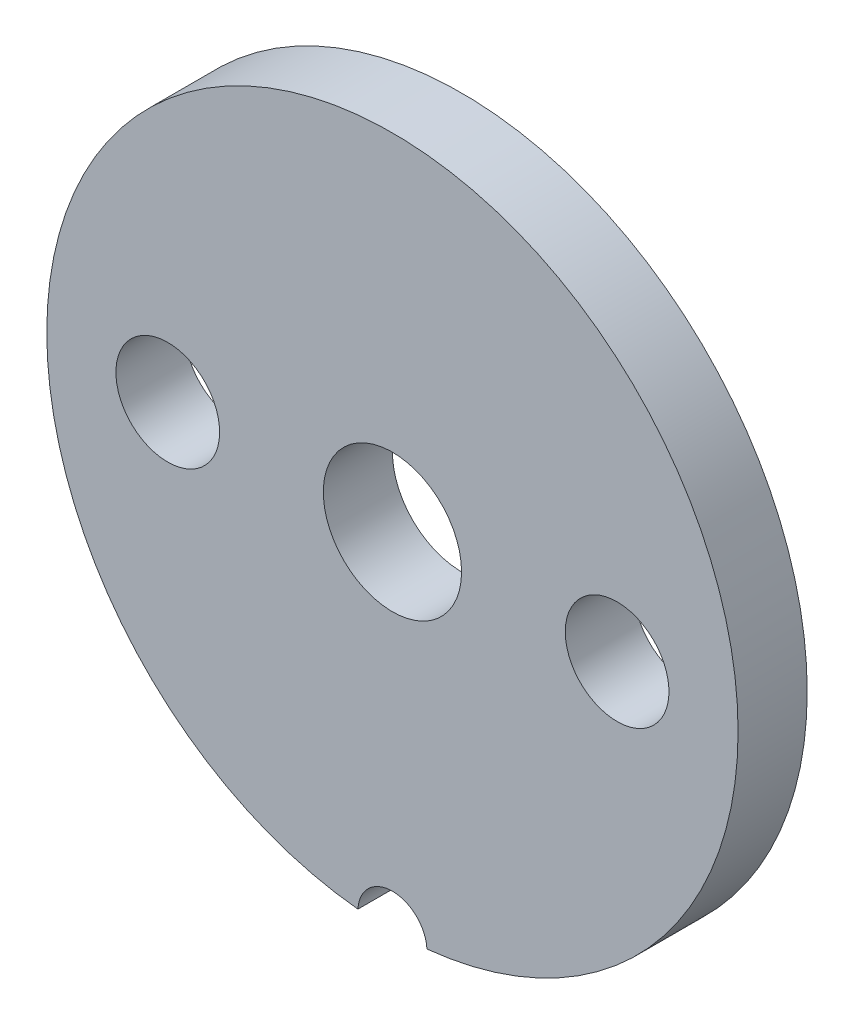
ISO-10303-21;
HEADER;
FILE_DESCRIPTION(('STEP AP214'),'2;1');
FILE_NAME('part.step','',(''),(''),'','','');
FILE_SCHEMA(('AUTOMOTIVE_DESIGN { 1 0 10303 214 1 1 1 1 }'));
ENDSEC;
DATA;
#1=APPLICATION_CONTEXT('core data for automotive mechanical design processes');
#2=APPLICATION_PROTOCOL_DEFINITION('international standard','automotive_design',2000,#1);
#3=PRODUCT_CONTEXT('',#1,'mechanical');
#4=PRODUCT('Part','Part','',(#3));
#5=PRODUCT_RELATED_PRODUCT_CATEGORY('part','',(#4));
#6=PRODUCT_DEFINITION_FORMATION('','',#4);
#7=PRODUCT_DEFINITION_CONTEXT('part definition',#1,'design');
#8=PRODUCT_DEFINITION('design','',#6,#7);
#9=PRODUCT_DEFINITION_SHAPE('','',#8);
#10=(LENGTH_UNIT() NAMED_UNIT(*) SI_UNIT(.MILLI.,.METRE.));
#11=(NAMED_UNIT(*) PLANE_ANGLE_UNIT() SI_UNIT($,.RADIAN.));
#12=(NAMED_UNIT(*) SI_UNIT($,.STERADIAN.) SOLID_ANGLE_UNIT());
#13=UNCERTAINTY_MEASURE_WITH_UNIT(LENGTH_MEASURE(1.E-05),#10,'distance_accuracy_value','');
#14=(GEOMETRIC_REPRESENTATION_CONTEXT(3) GLOBAL_UNCERTAINTY_ASSIGNED_CONTEXT((#13)) GLOBAL_UNIT_ASSIGNED_CONTEXT((#10,
#11,#12)) REPRESENTATION_CONTEXT('',''));
#15=CARTESIAN_POINT('',(0.,0.,0.));
#16=DIRECTION('',(0.,0.,1.));
#17=DIRECTION('',(1.,0.,0.));
#18=AXIS2_PLACEMENT_3D('',#15,#16,#17);
#19=CARTESIAN_POINT('',(0.783567134268554,-3.89178356713428,2.));
#20=DIRECTION('',(0.,0.,1.));
#21=DIRECTION('',(1.,0.,0.));
#22=AXIS2_PLACEMENT_3D('',#19,#20,#21);
#23=PLANE('',#22);
#24=CARTESIAN_POINT('',(0.783567134268554,-13.8917835671343,2.));
#25=DIRECTION('',(0.,0.,1.));
#26=DIRECTION('',(1.,0.,0.));
#27=AXIS2_PLACEMENT_3D('',#24,#25,#26);
#28=CIRCLE('',#27,1.);
#29=CARTESIAN_POINT('',(1.78231635204046,-13.8417835671343,2.));
#30=VERTEX_POINT('',#29);
#31=CARTESIAN_POINT('',(-0.215182083503355,-13.8417835671343,2.));
#32=VERTEX_POINT('',#31);
#33=EDGE_CURVE('E63',#30,#32,#28,.T.);
#34=ORIENTED_EDGE('',*,*,#33,.F.);
#35=CARTESIAN_POINT('',(0.783567134268554,-3.89178356713428,2.));
#36=DIRECTION('',(0.,0.,1.));
#37=DIRECTION('',(1.,0.,0.));
#38=AXIS2_PLACEMENT_3D('',#35,#36,#37);
#39=CIRCLE('',#38,10.);
#40=EDGE_CURVE('E69',#30,#32,#39,.T.);
#41=ORIENTED_EDGE('',*,*,#40,.T.);
#42=EDGE_LOOP('',(#34,#41));
#43=FACE_BOUND('',#42,.T.);
#44=CARTESIAN_POINT('',(7.28356713426855,-3.89178356713428,2.));
#45=DIRECTION('',(0.,0.,1.));
#46=DIRECTION('',(-1.,0.,0.));
#47=AXIS2_PLACEMENT_3D('',#44,#45,#46);
#48=CIRCLE('',#47,1.5);
#49=CARTESIAN_POINT('',(5.78356713426855,-3.89178356713428,2.));
#50=VERTEX_POINT('',#49);
#51=EDGE_CURVE('E86',#50,#50,#48,.T.);
#52=ORIENTED_EDGE('',*,*,#51,.F.);
#53=EDGE_LOOP('',(#52));
#54=FACE_BOUND('',#53,.T.);
#55=CARTESIAN_POINT('',(-5.71643286573145,-3.89178356713428,2.));
#56=DIRECTION('',(0.,0.,1.));
#57=DIRECTION('',(1.,0.,0.));
#58=AXIS2_PLACEMENT_3D('',#55,#56,#57);
#59=CIRCLE('',#58,1.5);
#60=CARTESIAN_POINT('',(-4.21643286573145,-3.89178356713428,2.));
#61=VERTEX_POINT('',#60);
#62=EDGE_CURVE('E79',#61,#61,#59,.T.);
#63=ORIENTED_EDGE('',*,*,#62,.F.);
#64=EDGE_LOOP('',(#63));
#65=FACE_BOUND('',#64,.T.);
#66=CARTESIAN_POINT('',(0.783567134268554,-3.89178356713428,2.));
#67=DIRECTION('',(0.,0.,1.));
#68=DIRECTION('',(1.,0.,0.));
#69=AXIS2_PLACEMENT_3D('',#66,#67,#68);
#70=CIRCLE('',#69,2.);
#71=CARTESIAN_POINT('',(2.78356713426855,-3.89178356713428,2.));
#72=VERTEX_POINT('',#71);
#73=EDGE_CURVE('E94',#72,#72,#70,.T.);
#74=ORIENTED_EDGE('',*,*,#73,.F.);
#75=EDGE_LOOP('',(#74));
#76=FACE_BOUND('',#75,.T.);
#77=ADVANCED_FACE('F38',(#43,#54,#65,#76),#23,.T.);
#78=CARTESIAN_POINT('',(0.783567134268554,-3.89178356713428,0.));
#79=DIRECTION('',(0.,0.,1.));
#80=DIRECTION('',(1.,0.,0.));
#81=AXIS2_PLACEMENT_3D('',#78,#79,#80);
#82=PLANE('',#81);
#83=CARTESIAN_POINT('',(0.783567134268554,-3.89178356713428,0.));
#84=DIRECTION('',(0.,0.,1.));
#85=DIRECTION('',(1.,0.,0.));
#86=AXIS2_PLACEMENT_3D('',#83,#84,#85);
#87=CIRCLE('',#86,10.);
#88=CARTESIAN_POINT('',(1.78231635204047,-13.8417835671343,0.));
#89=VERTEX_POINT('',#88);
#90=CARTESIAN_POINT('',(-0.215182083503354,-13.8417835671343,0.));
#91=VERTEX_POINT('',#90);
#92=EDGE_CURVE('E76',#89,#91,#87,.T.);
#93=ORIENTED_EDGE('',*,*,#92,.F.);
#94=CARTESIAN_POINT('',(0.783567134268554,-13.8917835671343,0.));
#95=DIRECTION('',(0.,0.,1.));
#96=DIRECTION('',(1.,0.,0.));
#97=AXIS2_PLACEMENT_3D('',#94,#95,#96);
#98=CIRCLE('',#97,1.);
#99=EDGE_CURVE('E54',#89,#91,#98,.T.);
#100=ORIENTED_EDGE('',*,*,#99,.T.);
#101=EDGE_LOOP('',(#93,#100));
#102=FACE_BOUND('',#101,.T.);
#103=CARTESIAN_POINT('',(-5.71643286573145,-3.89178356713428,0.));
#104=DIRECTION('',(0.,0.,1.));
#105=DIRECTION('',(1.,0.,0.));
#106=AXIS2_PLACEMENT_3D('',#103,#104,#105);
#107=CIRCLE('',#106,1.5);
#108=CARTESIAN_POINT('',(-4.21643286573145,-3.89178356713428,0.));
#109=VERTEX_POINT('',#108);
#110=EDGE_CURVE('E82',#109,#109,#107,.T.);
#111=ORIENTED_EDGE('',*,*,#110,.T.);
#112=EDGE_LOOP('',(#111));
#113=FACE_BOUND('',#112,.T.);
#114=CARTESIAN_POINT('',(7.28356713426855,-3.89178356713428,0.));
#115=DIRECTION('',(0.,0.,1.));
#116=DIRECTION('',(-1.,0.,0.));
#117=AXIS2_PLACEMENT_3D('',#114,#115,#116);
#118=CIRCLE('',#117,1.5);
#119=CARTESIAN_POINT('',(5.78356713426855,-3.89178356713428,0.));
#120=VERTEX_POINT('',#119);
#121=EDGE_CURVE('E90',#120,#120,#118,.T.);
#122=ORIENTED_EDGE('',*,*,#121,.T.);
#123=EDGE_LOOP('',(#122));
#124=FACE_BOUND('',#123,.T.);
#125=CARTESIAN_POINT('',(0.783567134268554,-3.89178356713428,0.));
#126=DIRECTION('',(0.,0.,1.));
#127=DIRECTION('',(1.,0.,0.));
#128=AXIS2_PLACEMENT_3D('',#125,#126,#127);
#129=CIRCLE('',#128,2.);
#130=CARTESIAN_POINT('',(2.78356713426855,-3.89178356713428,0.));
#131=VERTEX_POINT('',#130);
#132=EDGE_CURVE('E98',#131,#131,#129,.T.);
#133=ORIENTED_EDGE('',*,*,#132,.T.);
#134=EDGE_LOOP('',(#133));
#135=FACE_BOUND('',#134,.T.);
#136=ADVANCED_FACE('F107',(#102,#113,#124,#135),#82,.F.);
#137=CARTESIAN_POINT('',(0.783567134268554,-3.89178356713428,2.));
#138=DIRECTION('',(0.,0.,-1.));
#139=DIRECTION('',(-1.,0.,0.));
#140=AXIS2_PLACEMENT_3D('',#137,#138,#139);
#141=CYLINDRICAL_SURFACE('',#140,10.);
#142=ORIENTED_EDGE('',*,*,#92,.T.);
#143=DIRECTION('',(0.,0.,1.));
#144=VECTOR('',#143,1.);
#145=CARTESIAN_POINT('',(-0.215182083503355,-13.8417835671343,-3.));
#146=LINE('',#145,#144);
#147=EDGE_CURVE('E11',#91,#32,#146,.T.);
#148=ORIENTED_EDGE('',*,*,#147,.T.);
#149=ORIENTED_EDGE('',*,*,#40,.F.);
#150=DIRECTION('',(0.,0.,1.));
#151=VECTOR('',#150,1.);
#152=CARTESIAN_POINT('',(1.78231635204046,-13.8417835671343,-3.));
#153=LINE('',#152,#151);
#154=EDGE_CURVE('E47',#30,#89,#153,.F.);
#155=ORIENTED_EDGE('',*,*,#154,.T.);
#156=EDGE_LOOP('',(#142,#148,#149,#155));
#157=FACE_BOUND('',#156,.T.);
#158=ADVANCED_FACE('F40',(#157),#141,.T.);
#159=CARTESIAN_POINT('',(-5.71643286573145,-3.89178356713428,2.));
#160=DIRECTION('',(0.,0.,-1.));
#161=DIRECTION('',(-1.,0.,0.));
#162=AXIS2_PLACEMENT_3D('',#159,#160,#161);
#163=CYLINDRICAL_SURFACE('',#162,1.5);
#164=ORIENTED_EDGE('',*,*,#62,.T.);
#165=EDGE_LOOP('',(#164));
#166=FACE_BOUND('',#165,.T.);
#167=ORIENTED_EDGE('',*,*,#110,.F.);
#168=EDGE_LOOP('',(#167));
#169=FACE_BOUND('',#168,.T.);
#170=ADVANCED_FACE('F126',(#166,#169),#163,.F.);
#171=CARTESIAN_POINT('',(7.28356713426855,-3.89178356713428,2.));
#172=DIRECTION('',(0.,0.,-1.));
#173=DIRECTION('',(-1.,0.,0.));
#174=AXIS2_PLACEMENT_3D('',#171,#172,#173);
#175=CYLINDRICAL_SURFACE('',#174,1.5);
#176=ORIENTED_EDGE('',*,*,#51,.T.);
#177=EDGE_LOOP('',(#176));
#178=FACE_BOUND('',#177,.T.);
#179=ORIENTED_EDGE('',*,*,#121,.F.);
#180=EDGE_LOOP('',(#179));
#181=FACE_BOUND('',#180,.T.);
#182=ADVANCED_FACE('F118',(#178,#181),#175,.F.);
#183=CARTESIAN_POINT('',(0.783567134268554,-3.89178356713428,2.));
#184=DIRECTION('',(0.,0.,-1.));
#185=DIRECTION('',(-1.,0.,0.));
#186=AXIS2_PLACEMENT_3D('',#183,#184,#185);
#187=CYLINDRICAL_SURFACE('',#186,2.);
#188=ORIENTED_EDGE('',*,*,#73,.T.);
#189=EDGE_LOOP('',(#188));
#190=FACE_BOUND('',#189,.T.);
#191=ORIENTED_EDGE('',*,*,#132,.F.);
#192=EDGE_LOOP('',(#191));
#193=FACE_BOUND('',#192,.T.);
#194=ADVANCED_FACE('F116',(#190,#193),#187,.F.);
#195=CARTESIAN_POINT('',(0.783567134268554,-13.8917835671343,-8.));
#196=DIRECTION('',(0.,0.,1.));
#197=DIRECTION('',(1.,0.,0.));
#198=AXIS2_PLACEMENT_3D('',#195,#196,#197);
#199=CYLINDRICAL_SURFACE('',#198,1.);
#200=ORIENTED_EDGE('',*,*,#99,.F.);
#201=ORIENTED_EDGE('',*,*,#154,.F.);
#202=ORIENTED_EDGE('',*,*,#33,.T.);
#203=ORIENTED_EDGE('',*,*,#147,.F.);
#204=EDGE_LOOP('',(#200,#201,#202,#203));
#205=FACE_BOUND('',#204,.T.);
#206=ADVANCED_FACE('F62',(#205),#199,.F.);
#207=CLOSED_SHELL('',(#77,#136,#158,#170,#182,#194,#206));
#208=MANIFOLD_SOLID_BREP('B2',#207);
#209=ADVANCED_BREP_SHAPE_REPRESENTATION('',(#18,#208),#14);
#210=SHAPE_DEFINITION_REPRESENTATION(#9,#209);
ENDSEC;
END-ISO-10303-21;
